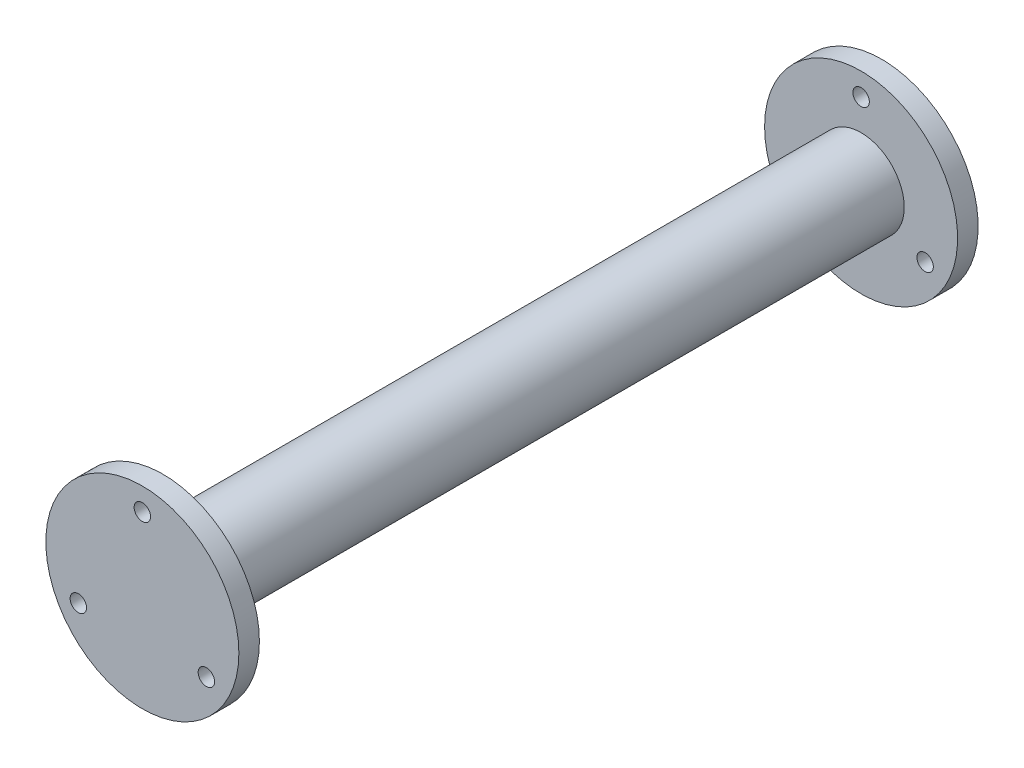
ISO-10303-21;
HEADER;
FILE_DESCRIPTION(('STEP AP214'),'2;1');
FILE_NAME('part.step','',(''),(''),'','','');
FILE_SCHEMA(('AUTOMOTIVE_DESIGN { 1 0 10303 214 1 1 1 1 }'));
ENDSEC;
DATA;
#1=APPLICATION_CONTEXT('core data for automotive mechanical design processes');
#2=APPLICATION_PROTOCOL_DEFINITION('international standard','automotive_design',2000,#1);
#3=PRODUCT_CONTEXT('',#1,'mechanical');
#4=PRODUCT('Part','Part','',(#3));
#5=PRODUCT_RELATED_PRODUCT_CATEGORY('part','',(#4));
#6=PRODUCT_DEFINITION_FORMATION('','',#4);
#7=PRODUCT_DEFINITION_CONTEXT('part definition',#1,'design');
#8=PRODUCT_DEFINITION('design','',#6,#7);
#9=PRODUCT_DEFINITION_SHAPE('','',#8);
#10=(LENGTH_UNIT() NAMED_UNIT(*) SI_UNIT(.MILLI.,.METRE.));
#11=(NAMED_UNIT(*) PLANE_ANGLE_UNIT() SI_UNIT($,.RADIAN.));
#12=(NAMED_UNIT(*) SI_UNIT($,.STERADIAN.) SOLID_ANGLE_UNIT());
#13=UNCERTAINTY_MEASURE_WITH_UNIT(LENGTH_MEASURE(1.E-05),#10,'distance_accuracy_value','');
#14=(GEOMETRIC_REPRESENTATION_CONTEXT(3) GLOBAL_UNCERTAINTY_ASSIGNED_CONTEXT((#13)) GLOBAL_UNIT_ASSIGNED_CONTEXT((#10,
#11,#12)) REPRESENTATION_CONTEXT('',''));
#15=CARTESIAN_POINT('',(0.,0.,0.));
#16=DIRECTION('',(0.,0.,1.));
#17=DIRECTION('',(1.,0.,0.));
#18=AXIS2_PLACEMENT_3D('',#15,#16,#17);
#19=CARTESIAN_POINT('',(0.,0.,170.));
#20=DIRECTION('',(0.,0.,-1.));
#21=DIRECTION('',(-1.,0.,0.));
#22=AXIS2_PLACEMENT_3D('',#19,#20,#21);
#23=CYLINDRICAL_SURFACE('',#22,10.5);
#24=CARTESIAN_POINT('',(0.,0.,170.));
#25=DIRECTION('',(0.,0.,1.));
#26=DIRECTION('',(1.,0.,0.));
#27=AXIS2_PLACEMENT_3D('',#24,#25,#26);
#28=CIRCLE('',#27,10.5);
#29=CARTESIAN_POINT('',(10.5,0.,170.));
#30=VERTEX_POINT('',#29);
#31=EDGE_CURVE('E10',#30,#30,#28,.T.);
#32=ORIENTED_EDGE('',*,*,#31,.F.);
#33=EDGE_LOOP('',(#32));
#34=FACE_BOUND('',#33,.T.);
#35=CARTESIAN_POINT('',(0.,0.,0.));
#36=DIRECTION('',(0.,0.,1.));
#37=DIRECTION('',(1.,0.,0.));
#38=AXIS2_PLACEMENT_3D('',#35,#36,#37);
#39=CIRCLE('',#38,10.5);
#40=CARTESIAN_POINT('',(10.5,0.,0.));
#41=VERTEX_POINT('',#40);
#42=EDGE_CURVE('E36',#41,#41,#39,.T.);
#43=ORIENTED_EDGE('',*,*,#42,.T.);
#44=EDGE_LOOP('',(#43));
#45=FACE_BOUND('',#44,.T.);
#46=ADVANCED_FACE('F33',(#34,#45),#23,.T.);
#47=CARTESIAN_POINT('',(0.,0.,175.));
#48=DIRECTION('',(0.,0.,1.));
#49=DIRECTION('',(1.,0.,0.));
#50=AXIS2_PLACEMENT_3D('',#47,#48,#49);
#51=PLANE('',#50);
#52=CARTESIAN_POINT('',(-15.5884572681199,-9.,175.));
#53=DIRECTION('',(0.,0.,1.));
#54=DIRECTION('',(1.,0.,0.));
#55=AXIS2_PLACEMENT_3D('',#52,#53,#54);
#56=CIRCLE('',#55,2.);
#57=CARTESIAN_POINT('',(-13.5884572681199,-9.,175.));
#58=VERTEX_POINT('',#57);
#59=EDGE_CURVE('E53',#58,#58,#56,.T.);
#60=ORIENTED_EDGE('',*,*,#59,.F.);
#61=EDGE_LOOP('',(#60));
#62=FACE_BOUND('',#61,.T.);
#63=CARTESIAN_POINT('',(0.,0.,175.));
#64=DIRECTION('',(0.,0.,1.));
#65=DIRECTION('',(1.,0.,0.));
#66=AXIS2_PLACEMENT_3D('',#63,#64,#65);
#67=CIRCLE('',#66,23.5);
#68=CARTESIAN_POINT('',(23.5,0.,175.));
#69=VERTEX_POINT('',#68);
#70=EDGE_CURVE('E40',#69,#69,#67,.T.);
#71=ORIENTED_EDGE('',*,*,#70,.T.);
#72=EDGE_LOOP('',(#71));
#73=FACE_BOUND('',#72,.T.);
#74=CARTESIAN_POINT('',(0.,18.,175.));
#75=DIRECTION('',(0.,0.,1.));
#76=DIRECTION('',(1.,0.,0.));
#77=AXIS2_PLACEMENT_3D('',#74,#75,#76);
#78=CIRCLE('',#77,2.);
#79=CARTESIAN_POINT('',(2.,18.,175.));
#80=VERTEX_POINT('',#79);
#81=EDGE_CURVE('E48',#80,#80,#78,.T.);
#82=ORIENTED_EDGE('',*,*,#81,.F.);
#83=EDGE_LOOP('',(#82));
#84=FACE_BOUND('',#83,.T.);
#85=CARTESIAN_POINT('',(15.5884572681199,-9.,175.));
#86=DIRECTION('',(0.,0.,1.));
#87=DIRECTION('',(1.,0.,0.));
#88=AXIS2_PLACEMENT_3D('',#85,#86,#87);
#89=CIRCLE('',#88,2.);
#90=CARTESIAN_POINT('',(17.5884572681199,-9.,175.));
#91=VERTEX_POINT('',#90);
#92=EDGE_CURVE('E59',#91,#91,#89,.T.);
#93=ORIENTED_EDGE('',*,*,#92,.F.);
#94=EDGE_LOOP('',(#93));
#95=FACE_BOUND('',#94,.T.);
#96=ADVANCED_FACE('F115',(#62,#73,#84,#95),#51,.T.);
#97=CARTESIAN_POINT('',(0.,0.,170.));
#98=DIRECTION('',(0.,0.,1.));
#99=DIRECTION('',(1.,0.,0.));
#100=AXIS2_PLACEMENT_3D('',#97,#98,#99);
#101=PLANE('',#100);
#102=ORIENTED_EDGE('',*,*,#31,.T.);
#103=EDGE_LOOP('',(#102));
#104=FACE_BOUND('',#103,.T.);
#105=CARTESIAN_POINT('',(0.,0.,170.));
#106=DIRECTION('',(0.,0.,1.));
#107=DIRECTION('',(1.,0.,0.));
#108=AXIS2_PLACEMENT_3D('',#105,#106,#107);
#109=CIRCLE('',#108,23.5);
#110=CARTESIAN_POINT('',(23.5,0.,170.));
#111=VERTEX_POINT('',#110);
#112=EDGE_CURVE('E44',#111,#111,#109,.T.);
#113=ORIENTED_EDGE('',*,*,#112,.F.);
#114=EDGE_LOOP('',(#113));
#115=FACE_BOUND('',#114,.T.);
#116=CARTESIAN_POINT('',(0.,18.,170.));
#117=DIRECTION('',(0.,0.,1.));
#118=DIRECTION('',(1.,0.,0.));
#119=AXIS2_PLACEMENT_3D('',#116,#117,#118);
#120=CIRCLE('',#119,2.);
#121=CARTESIAN_POINT('',(2.,18.,170.));
#122=VERTEX_POINT('',#121);
#123=EDGE_CURVE('E50',#122,#122,#120,.T.);
#124=ORIENTED_EDGE('',*,*,#123,.T.);
#125=EDGE_LOOP('',(#124));
#126=FACE_BOUND('',#125,.T.);
#127=CARTESIAN_POINT('',(-15.5884572681199,-9.,170.));
#128=DIRECTION('',(0.,0.,1.));
#129=DIRECTION('',(1.,0.,0.));
#130=AXIS2_PLACEMENT_3D('',#127,#128,#129);
#131=CIRCLE('',#130,2.);
#132=CARTESIAN_POINT('',(-13.5884572681199,-9.,170.));
#133=VERTEX_POINT('',#132);
#134=EDGE_CURVE('E56',#133,#133,#131,.T.);
#135=ORIENTED_EDGE('',*,*,#134,.T.);
#136=EDGE_LOOP('',(#135));
#137=FACE_BOUND('',#136,.T.);
#138=CARTESIAN_POINT('',(15.5884572681199,-9.,170.));
#139=DIRECTION('',(0.,0.,1.));
#140=DIRECTION('',(1.,0.,0.));
#141=AXIS2_PLACEMENT_3D('',#138,#139,#140);
#142=CIRCLE('',#141,2.);
#143=CARTESIAN_POINT('',(17.5884572681199,-9.,170.));
#144=VERTEX_POINT('',#143);
#145=EDGE_CURVE('E62',#144,#144,#142,.T.);
#146=ORIENTED_EDGE('',*,*,#145,.T.);
#147=EDGE_LOOP('',(#146));
#148=FACE_BOUND('',#147,.T.);
#149=ADVANCED_FACE('F120',(#104,#115,#126,#137,#148),#101,.F.);
#150=CARTESIAN_POINT('',(0.,0.,175.));
#151=DIRECTION('',(0.,0.,-1.));
#152=DIRECTION('',(-1.,0.,0.));
#153=AXIS2_PLACEMENT_3D('',#150,#151,#152);
#154=CYLINDRICAL_SURFACE('',#153,23.5);
#155=ORIENTED_EDGE('',*,*,#70,.F.);
#156=EDGE_LOOP('',(#155));
#157=FACE_BOUND('',#156,.T.);
#158=ORIENTED_EDGE('',*,*,#112,.T.);
#159=EDGE_LOOP('',(#158));
#160=FACE_BOUND('',#159,.T.);
#161=ADVANCED_FACE('F163',(#157,#160),#154,.T.);
#162=CARTESIAN_POINT('',(0.,18.,175.));
#163=DIRECTION('',(0.,0.,-1.));
#164=DIRECTION('',(-1.,0.,0.));
#165=AXIS2_PLACEMENT_3D('',#162,#163,#164);
#166=CYLINDRICAL_SURFACE('',#165,2.);
#167=ORIENTED_EDGE('',*,*,#81,.T.);
#168=EDGE_LOOP('',(#167));
#169=FACE_BOUND('',#168,.T.);
#170=ORIENTED_EDGE('',*,*,#123,.F.);
#171=EDGE_LOOP('',(#170));
#172=FACE_BOUND('',#171,.T.);
#173=ADVANCED_FACE('F160',(#169,#172),#166,.F.);
#174=CARTESIAN_POINT('',(-15.5884572681199,-9.,175.));
#175=DIRECTION('',(0.,0.,-1.));
#176=DIRECTION('',(-1.,0.,0.));
#177=AXIS2_PLACEMENT_3D('',#174,#175,#176);
#178=CYLINDRICAL_SURFACE('',#177,2.);
#179=ORIENTED_EDGE('',*,*,#59,.T.);
#180=EDGE_LOOP('',(#179));
#181=FACE_BOUND('',#180,.T.);
#182=ORIENTED_EDGE('',*,*,#134,.F.);
#183=EDGE_LOOP('',(#182));
#184=FACE_BOUND('',#183,.T.);
#185=ADVANCED_FACE('F108',(#181,#184),#178,.F.);
#186=CARTESIAN_POINT('',(15.5884572681199,-9.,175.));
#187=DIRECTION('',(0.,0.,-1.));
#188=DIRECTION('',(-1.,0.,0.));
#189=AXIS2_PLACEMENT_3D('',#186,#187,#188);
#190=CYLINDRICAL_SURFACE('',#189,2.);
#191=ORIENTED_EDGE('',*,*,#92,.T.);
#192=EDGE_LOOP('',(#191));
#193=FACE_BOUND('',#192,.T.);
#194=ORIENTED_EDGE('',*,*,#145,.F.);
#195=EDGE_LOOP('',(#194));
#196=FACE_BOUND('',#195,.T.);
#197=ADVANCED_FACE('F98',(#193,#196),#190,.F.);
#198=CARTESIAN_POINT('',(0.,0.,-5.));
#199=DIRECTION('',(0.,0.,-1.));
#200=DIRECTION('',(-1.,0.,0.));
#201=AXIS2_PLACEMENT_3D('',#198,#199,#200);
#202=PLANE('',#201);
#203=CARTESIAN_POINT('',(-15.5884572681199,-9.,-5.));
#204=DIRECTION('',(0.,0.,-1.));
#205=DIRECTION('',(-1.,0.,0.));
#206=AXIS2_PLACEMENT_3D('',#203,#204,#205);
#207=CIRCLE('',#206,2.);
#208=CARTESIAN_POINT('',(-17.5884572681199,-9.,-5.));
#209=VERTEX_POINT('',#208);
#210=EDGE_CURVE('E77',#209,#209,#207,.T.);
#211=ORIENTED_EDGE('',*,*,#210,.F.);
#212=EDGE_LOOP('',(#211));
#213=FACE_BOUND('',#212,.T.);
#214=CARTESIAN_POINT('',(0.,0.,-5.));
#215=DIRECTION('',(0.,0.,-1.));
#216=DIRECTION('',(-1.,0.,0.));
#217=AXIS2_PLACEMENT_3D('',#214,#215,#216);
#218=CIRCLE('',#217,23.5);
#219=CARTESIAN_POINT('',(-23.5,0.,-5.));
#220=VERTEX_POINT('',#219);
#221=EDGE_CURVE('E70',#220,#220,#218,.T.);
#222=ORIENTED_EDGE('',*,*,#221,.T.);
#223=EDGE_LOOP('',(#222));
#224=FACE_BOUND('',#223,.T.);
#225=CARTESIAN_POINT('',(0.,18.,-5.));
#226=DIRECTION('',(0.,0.,-1.));
#227=DIRECTION('',(-1.,0.,0.));
#228=AXIS2_PLACEMENT_3D('',#225,#226,#227);
#229=CIRCLE('',#228,2.);
#230=CARTESIAN_POINT('',(-2.,18.,-5.));
#231=VERTEX_POINT('',#230);
#232=EDGE_CURVE('E71',#231,#231,#229,.T.);
#233=ORIENTED_EDGE('',*,*,#232,.F.);
#234=EDGE_LOOP('',(#233));
#235=FACE_BOUND('',#234,.T.);
#236=CARTESIAN_POINT('',(15.5884572681199,-9.,-5.));
#237=DIRECTION('',(0.,0.,-1.));
#238=DIRECTION('',(-1.,0.,0.));
#239=AXIS2_PLACEMENT_3D('',#236,#237,#238);
#240=CIRCLE('',#239,2.);
#241=CARTESIAN_POINT('',(13.5884572681199,-9.,-5.));
#242=VERTEX_POINT('',#241);
#243=EDGE_CURVE('E83',#242,#242,#240,.T.);
#244=ORIENTED_EDGE('',*,*,#243,.F.);
#245=EDGE_LOOP('',(#244));
#246=FACE_BOUND('',#245,.T.);
#247=ADVANCED_FACE('F95',(#213,#224,#235,#246),#202,.T.);
#248=CARTESIAN_POINT('',(0.,0.,0.));
#249=DIRECTION('',(0.,0.,-1.));
#250=DIRECTION('',(-1.,0.,0.));
#251=AXIS2_PLACEMENT_3D('',#248,#249,#250);
#252=PLANE('',#251);
#253=ORIENTED_EDGE('',*,*,#42,.F.);
#254=EDGE_LOOP('',(#253));
#255=FACE_BOUND('',#254,.T.);
#256=CARTESIAN_POINT('',(0.,0.,0.));
#257=DIRECTION('',(0.,0.,-1.));
#258=DIRECTION('',(-1.,0.,0.));
#259=AXIS2_PLACEMENT_3D('',#256,#257,#258);
#260=CIRCLE('',#259,23.5);
#261=CARTESIAN_POINT('',(-23.5,0.,0.));
#262=VERTEX_POINT('',#261);
#263=EDGE_CURVE('E67',#262,#262,#260,.T.);
#264=ORIENTED_EDGE('',*,*,#263,.F.);
#265=EDGE_LOOP('',(#264));
#266=FACE_BOUND('',#265,.T.);
#267=CARTESIAN_POINT('',(0.,18.,0.));
#268=DIRECTION('',(0.,0.,-1.));
#269=DIRECTION('',(-1.,0.,0.));
#270=AXIS2_PLACEMENT_3D('',#267,#268,#269);
#271=CIRCLE('',#270,2.);
#272=CARTESIAN_POINT('',(-2.,18.,0.));
#273=VERTEX_POINT('',#272);
#274=EDGE_CURVE('E74',#273,#273,#271,.T.);
#275=ORIENTED_EDGE('',*,*,#274,.T.);
#276=EDGE_LOOP('',(#275));
#277=FACE_BOUND('',#276,.T.);
#278=CARTESIAN_POINT('',(-15.5884572681199,-9.,0.));
#279=DIRECTION('',(0.,0.,-1.));
#280=DIRECTION('',(-1.,0.,0.));
#281=AXIS2_PLACEMENT_3D('',#278,#279,#280);
#282=CIRCLE('',#281,2.);
#283=CARTESIAN_POINT('',(-17.5884572681199,-9.,0.));
#284=VERTEX_POINT('',#283);
#285=EDGE_CURVE('E80',#284,#284,#282,.T.);
#286=ORIENTED_EDGE('',*,*,#285,.T.);
#287=EDGE_LOOP('',(#286));
#288=FACE_BOUND('',#287,.T.);
#289=CARTESIAN_POINT('',(15.5884572681199,-9.,0.));
#290=DIRECTION('',(0.,0.,-1.));
#291=DIRECTION('',(-1.,0.,0.));
#292=AXIS2_PLACEMENT_3D('',#289,#290,#291);
#293=CIRCLE('',#292,2.);
#294=CARTESIAN_POINT('',(13.5884572681199,-9.,0.));
#295=VERTEX_POINT('',#294);
#296=EDGE_CURVE('E86',#295,#295,#293,.T.);
#297=ORIENTED_EDGE('',*,*,#296,.T.);
#298=EDGE_LOOP('',(#297));
#299=FACE_BOUND('',#298,.T.);
#300=ADVANCED_FACE('F97',(#255,#266,#277,#288,#299),#252,.F.);
#301=CARTESIAN_POINT('',(0.,0.,-5.));
#302=DIRECTION('',(0.,0.,1.));
#303=DIRECTION('',(1.,0.,0.));
#304=AXIS2_PLACEMENT_3D('',#301,#302,#303);
#305=CYLINDRICAL_SURFACE('',#304,23.5);
#306=ORIENTED_EDGE('',*,*,#221,.F.);
#307=EDGE_LOOP('',(#306));
#308=FACE_BOUND('',#307,.T.);
#309=ORIENTED_EDGE('',*,*,#263,.T.);
#310=EDGE_LOOP('',(#309));
#311=FACE_BOUND('',#310,.T.);
#312=ADVANCED_FACE('F105',(#308,#311),#305,.T.);
#313=CARTESIAN_POINT('',(0.,18.,-5.));
#314=DIRECTION('',(0.,0.,1.));
#315=DIRECTION('',(1.,0.,0.));
#316=AXIS2_PLACEMENT_3D('',#313,#314,#315);
#317=CYLINDRICAL_SURFACE('',#316,2.);
#318=ORIENTED_EDGE('',*,*,#232,.T.);
#319=EDGE_LOOP('',(#318));
#320=FACE_BOUND('',#319,.T.);
#321=ORIENTED_EDGE('',*,*,#274,.F.);
#322=EDGE_LOOP('',(#321));
#323=FACE_BOUND('',#322,.T.);
#324=ADVANCED_FACE('F140',(#320,#323),#317,.F.);
#325=CARTESIAN_POINT('',(-15.5884572681199,-9.,-5.));
#326=DIRECTION('',(0.,0.,1.));
#327=DIRECTION('',(1.,0.,0.));
#328=AXIS2_PLACEMENT_3D('',#325,#326,#327);
#329=CYLINDRICAL_SURFACE('',#328,2.);
#330=ORIENTED_EDGE('',*,*,#210,.T.);
#331=EDGE_LOOP('',(#330));
#332=FACE_BOUND('',#331,.T.);
#333=ORIENTED_EDGE('',*,*,#285,.F.);
#334=EDGE_LOOP('',(#333));
#335=FACE_BOUND('',#334,.T.);
#336=ADVANCED_FACE('F135',(#332,#335),#329,.F.);
#337=CARTESIAN_POINT('',(15.5884572681199,-9.,-5.));
#338=DIRECTION('',(0.,0.,1.));
#339=DIRECTION('',(1.,0.,0.));
#340=AXIS2_PLACEMENT_3D('',#337,#338,#339);
#341=CYLINDRICAL_SURFACE('',#340,2.);
#342=ORIENTED_EDGE('',*,*,#243,.T.);
#343=EDGE_LOOP('',(#342));
#344=FACE_BOUND('',#343,.T.);
#345=ORIENTED_EDGE('',*,*,#296,.F.);
#346=EDGE_LOOP('',(#345));
#347=FACE_BOUND('',#346,.T.);
#348=ADVANCED_FACE('F92',(#344,#347),#341,.F.);
#349=CLOSED_SHELL('',(#46,#96,#149,#161,#173,#185,#197,#247,#300,#312,#324,#336,#348));
#350=MANIFOLD_SOLID_BREP('B2',#349);
#351=ADVANCED_BREP_SHAPE_REPRESENTATION('',(#18,#350),#14);
#352=SHAPE_DEFINITION_REPRESENTATION(#9,#351);
ENDSEC;
END-ISO-10303-21;
